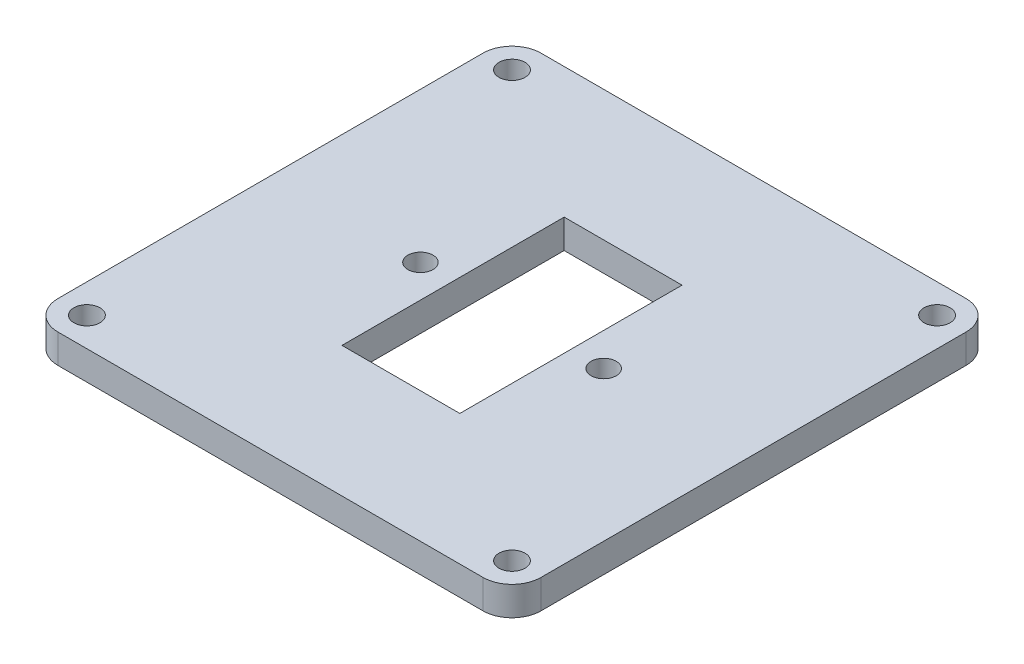
ISO-10303-21;
HEADER;
FILE_DESCRIPTION(('STEP AP214'),'2;1');
FILE_NAME('part.step','',(''),(''),'','','');
FILE_SCHEMA(('AUTOMOTIVE_DESIGN { 1 0 10303 214 1 1 1 1 }'));
ENDSEC;
DATA;
#1=APPLICATION_CONTEXT('core data for automotive mechanical design processes');
#2=APPLICATION_PROTOCOL_DEFINITION('international standard','automotive_design',2000,#1);
#3=PRODUCT_CONTEXT('',#1,'mechanical');
#4=PRODUCT('Part','Part','',(#3));
#5=PRODUCT_RELATED_PRODUCT_CATEGORY('part','',(#4));
#6=PRODUCT_DEFINITION_FORMATION('','',#4);
#7=PRODUCT_DEFINITION_CONTEXT('part definition',#1,'design');
#8=PRODUCT_DEFINITION('design','',#6,#7);
#9=PRODUCT_DEFINITION_SHAPE('','',#8);
#10=(LENGTH_UNIT() NAMED_UNIT(*) SI_UNIT(.MILLI.,.METRE.));
#11=(NAMED_UNIT(*) PLANE_ANGLE_UNIT() SI_UNIT($,.RADIAN.));
#12=(NAMED_UNIT(*) SI_UNIT($,.STERADIAN.) SOLID_ANGLE_UNIT());
#13=UNCERTAINTY_MEASURE_WITH_UNIT(LENGTH_MEASURE(1.E-05),#10,'distance_accuracy_value','');
#14=(GEOMETRIC_REPRESENTATION_CONTEXT(3) GLOBAL_UNCERTAINTY_ASSIGNED_CONTEXT((#13)) GLOBAL_UNIT_ASSIGNED_CONTEXT((#10,
#11,#12)) REPRESENTATION_CONTEXT('',''));
#15=CARTESIAN_POINT('',(0.,0.,0.));
#16=DIRECTION('',(0.,0.,1.));
#17=DIRECTION('',(1.,0.,0.));
#18=AXIS2_PLACEMENT_3D('',#15,#16,#17);
#19=CARTESIAN_POINT('',(-25.6485432343659,2.09377644502146,3.));
#20=DIRECTION('',(0.,-1.,0.));
#21=DIRECTION('',(0.,0.,-1.));
#22=AXIS2_PLACEMENT_3D('',#19,#20,#21);
#23=CYLINDRICAL_SURFACE('',#22,3.);
#24=CARTESIAN_POINT('',(-25.6485432343659,-0.90622355499125,3.));
#25=DIRECTION('',(0.,-1.,0.));
#26=DIRECTION('',(0.,0.,-1.));
#27=AXIS2_PLACEMENT_3D('',#24,#25,#26);
#28=CIRCLE('',#27,3.);
#29=CARTESIAN_POINT('',(-28.648543234366,-0.90622355499125,3.));
#30=VERTEX_POINT('',#29);
#31=CARTESIAN_POINT('',(-25.6485432343659,-0.90622355499125,0.));
#32=VERTEX_POINT('',#31);
#33=EDGE_CURVE('E196',#30,#32,#28,.T.);
#34=ORIENTED_EDGE('',*,*,#33,.F.);
#35=DIRECTION('',(0.,-1.,0.));
#36=VECTOR('',#35,1.);
#37=CARTESIAN_POINT('',(-28.648543234366,2.09377644502146,3.));
#38=LINE('',#37,#36);
#39=CARTESIAN_POINT('',(-28.648543234366,2.09377644502146,3.));
#40=VERTEX_POINT('',#39);
#41=EDGE_CURVE('E11',#40,#30,#38,.T.);
#42=ORIENTED_EDGE('',*,*,#41,.F.);
#43=CARTESIAN_POINT('',(-25.6485432343659,2.09377644502146,3.));
#44=DIRECTION('',(0.,-1.,0.));
#45=DIRECTION('',(0.,0.,-1.));
#46=AXIS2_PLACEMENT_3D('',#43,#44,#45);
#47=CIRCLE('',#46,3.);
#48=CARTESIAN_POINT('',(-25.6485432343659,2.09377644502146,0.));
#49=VERTEX_POINT('',#48);
#50=EDGE_CURVE('E199',#40,#49,#47,.T.);
#51=ORIENTED_EDGE('',*,*,#50,.T.);
#52=DIRECTION('',(0.,-1.,0.));
#53=VECTOR('',#52,1.);
#54=CARTESIAN_POINT('',(-25.6485432343659,2.09377644502146,0.));
#55=LINE('',#54,#53);
#56=EDGE_CURVE('E40',#49,#32,#55,.T.);
#57=ORIENTED_EDGE('',*,*,#56,.T.);
#58=EDGE_LOOP('',(#34,#42,#51,#57));
#59=FACE_BOUND('',#58,.T.);
#60=ADVANCED_FACE('F37',(#59),#23,.T.);
#61=CARTESIAN_POINT('',(-28.648543234366,2.09377644502146,46.9999489860236));
#62=DIRECTION('',(-1.,0.,0.));
#63=DIRECTION('',(0.,0.,1.));
#64=AXIS2_PLACEMENT_3D('',#61,#62,#63);
#65=PLANE('',#64);
#66=DIRECTION('',(0.,0.,-1.));
#67=VECTOR('',#66,1.);
#68=CARTESIAN_POINT('',(-28.648543234366,-0.90622355499125,46.9999489860236));
#69=LINE('',#68,#67);
#70=CARTESIAN_POINT('',(-28.648543234366,-0.90622355499125,46.9999489860236));
#71=VERTEX_POINT('',#70);
#72=EDGE_CURVE('E203',#71,#30,#69,.T.);
#73=ORIENTED_EDGE('',*,*,#72,.F.);
#74=DIRECTION('',(0.,-1.,0.));
#75=VECTOR('',#74,1.);
#76=CARTESIAN_POINT('',(-28.648543234366,2.09377644502146,46.9999489860236));
#77=LINE('',#76,#75);
#78=CARTESIAN_POINT('',(-28.648543234366,2.09377644502146,46.9999489860236));
#79=VERTEX_POINT('',#78);
#80=EDGE_CURVE('E45',#79,#71,#77,.T.);
#81=ORIENTED_EDGE('',*,*,#80,.F.);
#82=DIRECTION('',(0.,0.,-1.));
#83=VECTOR('',#82,1.);
#84=CARTESIAN_POINT('',(-28.648543234366,2.09377644502146,46.9999489860236));
#85=LINE('',#84,#83);
#86=EDGE_CURVE('E221',#79,#40,#85,.T.);
#87=ORIENTED_EDGE('',*,*,#86,.T.);
#88=ORIENTED_EDGE('',*,*,#41,.T.);
#89=EDGE_LOOP('',(#73,#81,#87,#88));
#90=FACE_BOUND('',#89,.T.);
#91=ADVANCED_FACE('F268',(#90),#65,.T.);
#92=CARTESIAN_POINT('',(-25.6485432343659,2.09377644502146,46.9999489860236));
#93=DIRECTION('',(0.,-1.,0.));
#94=DIRECTION('',(0.,0.,-1.));
#95=AXIS2_PLACEMENT_3D('',#92,#93,#94);
#96=CYLINDRICAL_SURFACE('',#95,3.);
#97=CARTESIAN_POINT('',(-25.6485432343659,-0.90622355499125,46.9999489860236));
#98=DIRECTION('',(0.,-1.,0.));
#99=DIRECTION('',(0.,0.,-1.));
#100=AXIS2_PLACEMENT_3D('',#97,#98,#99);
#101=CIRCLE('',#100,3.);
#102=CARTESIAN_POINT('',(-25.6485432343659,-0.90622355499125,49.9999489860236));
#103=VERTEX_POINT('',#102);
#104=EDGE_CURVE('E241',#103,#71,#101,.T.);
#105=ORIENTED_EDGE('',*,*,#104,.F.);
#106=DIRECTION('',(0.,-1.,0.));
#107=VECTOR('',#106,1.);
#108=CARTESIAN_POINT('',(-25.6485432343659,2.09377644502146,49.9999489860236));
#109=LINE('',#108,#107);
#110=CARTESIAN_POINT('',(-25.6485432343659,2.09377644502146,49.9999489860236));
#111=VERTEX_POINT('',#110);
#112=EDGE_CURVE('E247',#111,#103,#109,.T.);
#113=ORIENTED_EDGE('',*,*,#112,.F.);
#114=CARTESIAN_POINT('',(-25.6485432343659,2.09377644502146,46.9999489860236));
#115=DIRECTION('',(0.,-1.,0.));
#116=DIRECTION('',(0.,0.,-1.));
#117=AXIS2_PLACEMENT_3D('',#114,#115,#116);
#118=CIRCLE('',#117,3.);
#119=EDGE_CURVE('E218',#111,#79,#118,.T.);
#120=ORIENTED_EDGE('',*,*,#119,.T.);
#121=ORIENTED_EDGE('',*,*,#80,.T.);
#122=EDGE_LOOP('',(#105,#113,#120,#121));
#123=FACE_BOUND('',#122,.T.);
#124=ADVANCED_FACE('F288',(#123),#96,.T.);
#125=CARTESIAN_POINT('',(18.3511023050874,2.09377644502146,49.9999489860236));
#126=DIRECTION('',(0.,0.,1.));
#127=DIRECTION('',(1.,0.,0.));
#128=AXIS2_PLACEMENT_3D('',#125,#126,#127);
#129=PLANE('',#128);
#130=DIRECTION('',(-1.,0.,0.));
#131=VECTOR('',#130,1.);
#132=CARTESIAN_POINT('',(18.3511023050874,-0.90622355499125,49.9999489860236));
#133=LINE('',#132,#131);
#134=CARTESIAN_POINT('',(18.3511023050874,-0.90622355499125,49.9999489860236));
#135=VERTEX_POINT('',#134);
#136=EDGE_CURVE('E238',#135,#103,#133,.T.);
#137=ORIENTED_EDGE('',*,*,#136,.F.);
#138=DIRECTION('',(0.,-1.,0.));
#139=VECTOR('',#138,1.);
#140=CARTESIAN_POINT('',(18.3511023050874,2.09377644502146,49.9999489860236));
#141=LINE('',#140,#139);
#142=CARTESIAN_POINT('',(18.3511023050874,2.09377644502146,49.9999489860236));
#143=VERTEX_POINT('',#142);
#144=EDGE_CURVE('E249',#143,#135,#141,.T.);
#145=ORIENTED_EDGE('',*,*,#144,.F.);
#146=DIRECTION('',(-1.,0.,0.));
#147=VECTOR('',#146,1.);
#148=CARTESIAN_POINT('',(18.3511023050874,2.09377644502146,49.9999489860236));
#149=LINE('',#148,#147);
#150=EDGE_CURVE('E215',#143,#111,#149,.T.);
#151=ORIENTED_EDGE('',*,*,#150,.T.);
#152=ORIENTED_EDGE('',*,*,#112,.T.);
#153=EDGE_LOOP('',(#137,#145,#151,#152));
#154=FACE_BOUND('',#153,.T.);
#155=ADVANCED_FACE('F286',(#154),#129,.T.);
#156=CARTESIAN_POINT('',(18.3511023050874,2.09377644502146,46.9999489860236));
#157=DIRECTION('',(0.,-1.,0.));
#158=DIRECTION('',(0.,0.,-1.));
#159=AXIS2_PLACEMENT_3D('',#156,#157,#158);
#160=CYLINDRICAL_SURFACE('',#159,3.);
#161=CARTESIAN_POINT('',(18.3511023050874,-0.90622355499125,46.9999489860236));
#162=DIRECTION('',(0.,-1.,0.));
#163=DIRECTION('',(0.,0.,-1.));
#164=AXIS2_PLACEMENT_3D('',#161,#162,#163);
#165=CIRCLE('',#164,3.);
#166=CARTESIAN_POINT('',(21.3511023050874,-0.90622355499125,46.9999489860236));
#167=VERTEX_POINT('',#166);
#168=EDGE_CURVE('E235',#167,#135,#165,.T.);
#169=ORIENTED_EDGE('',*,*,#168,.F.);
#170=DIRECTION('',(0.,-1.,0.));
#171=VECTOR('',#170,1.);
#172=CARTESIAN_POINT('',(21.3511023050874,2.09377644502146,46.9999489860236));
#173=LINE('',#172,#171);
#174=CARTESIAN_POINT('',(21.3511023050874,2.09377644502146,46.9999489860236));
#175=VERTEX_POINT('',#174);
#176=EDGE_CURVE('E251',#175,#167,#173,.T.);
#177=ORIENTED_EDGE('',*,*,#176,.F.);
#178=CARTESIAN_POINT('',(18.3511023050874,2.09377644502146,46.9999489860236));
#179=DIRECTION('',(0.,-1.,0.));
#180=DIRECTION('',(0.,0.,-1.));
#181=AXIS2_PLACEMENT_3D('',#178,#179,#180);
#182=CIRCLE('',#181,3.);
#183=EDGE_CURVE('E212',#175,#143,#182,.T.);
#184=ORIENTED_EDGE('',*,*,#183,.T.);
#185=ORIENTED_EDGE('',*,*,#144,.T.);
#186=EDGE_LOOP('',(#169,#177,#184,#185));
#187=FACE_BOUND('',#186,.T.);
#188=ADVANCED_FACE('F282',(#187),#160,.T.);
#189=CARTESIAN_POINT('',(21.3511023050874,2.09377644502146,3.));
#190=DIRECTION('',(1.,0.,0.));
#191=DIRECTION('',(0.,0.,-1.));
#192=AXIS2_PLACEMENT_3D('',#189,#190,#191);
#193=PLANE('',#192);
#194=DIRECTION('',(0.,0.,1.));
#195=VECTOR('',#194,1.);
#196=CARTESIAN_POINT('',(21.3511023050874,-0.90622355499125,3.));
#197=LINE('',#196,#195);
#198=CARTESIAN_POINT('',(21.3511023050874,-0.90622355499125,3.));
#199=VERTEX_POINT('',#198);
#200=EDGE_CURVE('E232',#199,#167,#197,.T.);
#201=ORIENTED_EDGE('',*,*,#200,.F.);
#202=DIRECTION('',(0.,-1.,0.));
#203=VECTOR('',#202,1.);
#204=CARTESIAN_POINT('',(21.3511023050874,2.09377644502146,3.));
#205=LINE('',#204,#203);
#206=CARTESIAN_POINT('',(21.3511023050874,2.09377644502146,3.));
#207=VERTEX_POINT('',#206);
#208=EDGE_CURVE('E253',#207,#199,#205,.T.);
#209=ORIENTED_EDGE('',*,*,#208,.F.);
#210=DIRECTION('',(0.,0.,1.));
#211=VECTOR('',#210,1.);
#212=CARTESIAN_POINT('',(21.3511023050874,2.09377644502146,3.));
#213=LINE('',#212,#211);
#214=EDGE_CURVE('E209',#207,#175,#213,.T.);
#215=ORIENTED_EDGE('',*,*,#214,.T.);
#216=ORIENTED_EDGE('',*,*,#176,.T.);
#217=EDGE_LOOP('',(#201,#209,#215,#216));
#218=FACE_BOUND('',#217,.T.);
#219=ADVANCED_FACE('F280',(#218),#193,.T.);
#220=CARTESIAN_POINT('',(18.3511023050874,2.09377644502146,3.));
#221=DIRECTION('',(0.,-1.,0.));
#222=DIRECTION('',(0.,0.,-1.));
#223=AXIS2_PLACEMENT_3D('',#220,#221,#222);
#224=CYLINDRICAL_SURFACE('',#223,3.);
#225=CARTESIAN_POINT('',(18.3511023050874,-0.90622355499125,3.));
#226=DIRECTION('',(0.,-1.,0.));
#227=DIRECTION('',(0.,0.,-1.));
#228=AXIS2_PLACEMENT_3D('',#225,#226,#227);
#229=CIRCLE('',#228,3.);
#230=CARTESIAN_POINT('',(18.3511023050874,-0.90622355499125,0.));
#231=VERTEX_POINT('',#230);
#232=EDGE_CURVE('E229',#231,#199,#229,.T.);
#233=ORIENTED_EDGE('',*,*,#232,.F.);
#234=DIRECTION('',(0.,-1.,0.));
#235=VECTOR('',#234,1.);
#236=CARTESIAN_POINT('',(18.3511023050874,2.09377644502146,0.));
#237=LINE('',#236,#235);
#238=CARTESIAN_POINT('',(18.3511023050874,2.09377644502146,0.));
#239=VERTEX_POINT('',#238);
#240=EDGE_CURVE('E254',#239,#231,#237,.T.);
#241=ORIENTED_EDGE('',*,*,#240,.F.);
#242=CARTESIAN_POINT('',(18.3511023050874,2.09377644502146,3.));
#243=DIRECTION('',(0.,-1.,0.));
#244=DIRECTION('',(0.,0.,-1.));
#245=AXIS2_PLACEMENT_3D('',#242,#243,#244);
#246=CIRCLE('',#245,3.);
#247=EDGE_CURVE('E206',#239,#207,#246,.T.);
#248=ORIENTED_EDGE('',*,*,#247,.T.);
#249=ORIENTED_EDGE('',*,*,#208,.T.);
#250=EDGE_LOOP('',(#233,#241,#248,#249));
#251=FACE_BOUND('',#250,.T.);
#252=ADVANCED_FACE('F276',(#251),#224,.T.);
#253=CARTESIAN_POINT('',(-25.6485432343659,2.09377644502146,0.));
#254=DIRECTION('',(0.,0.,-1.));
#255=DIRECTION('',(-1.,0.,0.));
#256=AXIS2_PLACEMENT_3D('',#253,#254,#255);
#257=PLANE('',#256);
#258=DIRECTION('',(1.,0.,0.));
#259=VECTOR('',#258,1.);
#260=CARTESIAN_POINT('',(-25.6485432343659,-0.90622355499125,0.));
#261=LINE('',#260,#259);
#262=EDGE_CURVE('E226',#32,#231,#261,.T.);
#263=ORIENTED_EDGE('',*,*,#262,.F.);
#264=ORIENTED_EDGE('',*,*,#56,.F.);
#265=DIRECTION('',(1.,0.,0.));
#266=VECTOR('',#265,1.);
#267=CARTESIAN_POINT('',(-25.6485432343659,2.09377644502146,0.));
#268=LINE('',#267,#266);
#269=EDGE_CURVE('E202',#49,#239,#268,.T.);
#270=ORIENTED_EDGE('',*,*,#269,.T.);
#271=ORIENTED_EDGE('',*,*,#240,.T.);
#272=EDGE_LOOP('',(#263,#264,#270,#271));
#273=FACE_BOUND('',#272,.T.);
#274=ADVANCED_FACE('F262',(#273),#257,.T.);
#275=CARTESIAN_POINT('',(-25.6485432343659,2.09377644502146,3.));
#276=DIRECTION('',(0.,-1.,0.));
#277=DIRECTION('',(0.,0.,-1.));
#278=AXIS2_PLACEMENT_3D('',#275,#276,#277);
#279=PLANE('',#278);
#280=DIRECTION('',(0.,0.,-1.));
#281=VECTOR('',#280,1.);
#282=CARTESIAN_POINT('',(-9.74872103199559,2.09377644502146,13.5001564161645));
#283=LINE('',#282,#281);
#284=CARTESIAN_POINT('',(-9.74872103199559,2.09377644502146,36.5008594697819));
#285=VERTEX_POINT('',#284);
#286=CARTESIAN_POINT('',(-9.74872103199559,2.09377644502146,13.5001564161645));
#287=VERTEX_POINT('',#286);
#288=EDGE_CURVE('E134',#285,#287,#283,.T.);
#289=ORIENTED_EDGE('',*,*,#288,.T.);
#290=DIRECTION('',(1.,0.,0.));
#291=VECTOR('',#290,1.);
#292=CARTESIAN_POINT('',(2.45169906501979,2.09377644502146,13.5001564161645));
#293=LINE('',#292,#291);
#294=CARTESIAN_POINT('',(2.45169906501979,2.09377644502146,13.5001564161645));
#295=VERTEX_POINT('',#294);
#296=EDGE_CURVE('E128',#287,#295,#293,.T.);
#297=ORIENTED_EDGE('',*,*,#296,.T.);
#298=DIRECTION('',(0.,0.,1.));
#299=VECTOR('',#298,1.);
#300=CARTESIAN_POINT('',(2.45169906501979,2.09377644502146,36.5008594697819));
#301=LINE('',#300,#299);
#302=CARTESIAN_POINT('',(2.45169906501979,2.09377644502146,36.5008594697819));
#303=VERTEX_POINT('',#302);
#304=EDGE_CURVE('E137',#295,#303,#301,.T.);
#305=ORIENTED_EDGE('',*,*,#304,.T.);
#306=DIRECTION('',(-1.,0.,0.));
#307=VECTOR('',#306,1.);
#308=CARTESIAN_POINT('',(-9.74872103199559,2.09377644502146,36.5008594697819));
#309=LINE('',#308,#307);
#310=EDGE_CURVE('E53',#303,#285,#309,.T.);
#311=ORIENTED_EDGE('',*,*,#310,.T.);
#312=EDGE_LOOP('',(#289,#297,#305,#311));
#313=FACE_BOUND('',#312,.T.);
#314=CARTESIAN_POINT('',(-13.1299046165957,2.09377644502146,24.9945014619877));
#315=DIRECTION('',(0.,-1.,0.));
#316=DIRECTION('',(0.,0.,1.));
#317=AXIS2_PLACEMENT_3D('',#314,#315,#316);
#318=CIRCLE('',#317,1.3);
#319=CARTESIAN_POINT('',(-13.1299046165957,2.09377644502146,26.2945014619877));
#320=VERTEX_POINT('',#319);
#321=EDGE_CURVE('E163',#320,#320,#318,.T.);
#322=ORIENTED_EDGE('',*,*,#321,.T.);
#323=EDGE_LOOP('',(#322));
#324=FACE_BOUND('',#323,.T.);
#325=CARTESIAN_POINT('',(5.87053383881225,2.09377644502146,25.0265481818453));
#326=DIRECTION('',(0.,-1.,0.));
#327=DIRECTION('',(0.,0.,1.));
#328=AXIS2_PLACEMENT_3D('',#325,#326,#327);
#329=CIRCLE('',#328,1.3);
#330=CARTESIAN_POINT('',(5.87053383881225,2.09377644502146,26.3265481818454));
#331=VERTEX_POINT('',#330);
#332=EDGE_CURVE('E169',#331,#331,#329,.T.);
#333=ORIENTED_EDGE('',*,*,#332,.T.);
#334=EDGE_LOOP('',(#333));
#335=FACE_BOUND('',#334,.T.);
#336=CARTESIAN_POINT('',(18.3511023050874,2.09377644502146,3.));
#337=DIRECTION('',(0.,-1.,0.));
#338=DIRECTION('',(0.,0.,1.));
#339=AXIS2_PLACEMENT_3D('',#336,#337,#338);
#340=CIRCLE('',#339,1.35);
#341=CARTESIAN_POINT('',(18.3511023050874,2.09377644502146,4.35));
#342=VERTEX_POINT('',#341);
#343=EDGE_CURVE('E175',#342,#342,#340,.T.);
#344=ORIENTED_EDGE('',*,*,#343,.T.);
#345=EDGE_LOOP('',(#344));
#346=FACE_BOUND('',#345,.T.);
#347=CARTESIAN_POINT('',(-25.6485432343659,2.09377644502146,46.9999489860236));
#348=DIRECTION('',(0.,-1.,0.));
#349=DIRECTION('',(0.,0.,1.));
#350=AXIS2_PLACEMENT_3D('',#347,#348,#349);
#351=CIRCLE('',#350,1.35);
#352=CARTESIAN_POINT('',(-25.6485432343659,2.09377644502146,48.3499489860236));
#353=VERTEX_POINT('',#352);
#354=EDGE_CURVE('E181',#353,#353,#351,.T.);
#355=ORIENTED_EDGE('',*,*,#354,.T.);
#356=EDGE_LOOP('',(#355));
#357=FACE_BOUND('',#356,.T.);
#358=CARTESIAN_POINT('',(-25.6485432343659,2.09377644502146,3.));
#359=DIRECTION('',(0.,-1.,0.));
#360=DIRECTION('',(0.,0.,1.));
#361=AXIS2_PLACEMENT_3D('',#358,#359,#360);
#362=CIRCLE('',#361,1.35);
#363=CARTESIAN_POINT('',(-25.6485432343659,2.09377644502146,4.35));
#364=VERTEX_POINT('',#363);
#365=EDGE_CURVE('E187',#364,#364,#362,.T.);
#366=ORIENTED_EDGE('',*,*,#365,.T.);
#367=EDGE_LOOP('',(#366));
#368=FACE_BOUND('',#367,.T.);
#369=CARTESIAN_POINT('',(18.3511023050874,2.09377644502146,46.9999489860236));
#370=DIRECTION('',(0.,-1.,0.));
#371=DIRECTION('',(0.,0.,1.));
#372=AXIS2_PLACEMENT_3D('',#369,#370,#371);
#373=CIRCLE('',#372,1.35);
#374=CARTESIAN_POINT('',(18.3511023050874,2.09377644502146,48.3499489860236));
#375=VERTEX_POINT('',#374);
#376=EDGE_CURVE('E193',#375,#375,#373,.T.);
#377=ORIENTED_EDGE('',*,*,#376,.T.);
#378=EDGE_LOOP('',(#377));
#379=FACE_BOUND('',#378,.T.);
#380=ORIENTED_EDGE('',*,*,#50,.F.);
#381=ORIENTED_EDGE('',*,*,#86,.F.);
#382=ORIENTED_EDGE('',*,*,#119,.F.);
#383=ORIENTED_EDGE('',*,*,#150,.F.);
#384=ORIENTED_EDGE('',*,*,#183,.F.);
#385=ORIENTED_EDGE('',*,*,#214,.F.);
#386=ORIENTED_EDGE('',*,*,#247,.F.);
#387=ORIENTED_EDGE('',*,*,#269,.F.);
#388=EDGE_LOOP('',(#380,#381,#382,#383,#384,#385,#386,#387));
#389=FACE_BOUND('',#388,.T.);
#390=ADVANCED_FACE('F141',(#313,#324,#335,#346,#357,#368,#379,#389),#279,.F.);
#391=CARTESIAN_POINT('',(-25.6485432343659,-0.90622355499125,3.));
#392=DIRECTION('',(0.,-1.,0.));
#393=DIRECTION('',(0.,0.,-1.));
#394=AXIS2_PLACEMENT_3D('',#391,#392,#393);
#395=PLANE('',#394);
#396=DIRECTION('',(1.,0.,0.));
#397=VECTOR('',#396,1.);
#398=CARTESIAN_POINT('',(2.45169906501979,-0.90622355499125,13.5001564161645));
#399=LINE('',#398,#397);
#400=CARTESIAN_POINT('',(-9.74872103199559,-0.90622355499125,13.5001564161645));
#401=VERTEX_POINT('',#400);
#402=CARTESIAN_POINT('',(2.45169906501979,-0.90622355499125,13.5001564161645));
#403=VERTEX_POINT('',#402);
#404=EDGE_CURVE('E61',#401,#403,#399,.T.);
#405=ORIENTED_EDGE('',*,*,#404,.F.);
#406=DIRECTION('',(0.,0.,-1.));
#407=VECTOR('',#406,1.);
#408=CARTESIAN_POINT('',(-9.74872103199559,-0.90622355499125,13.5001564161645));
#409=LINE('',#408,#407);
#410=CARTESIAN_POINT('',(-9.74872103199559,-0.90622355499125,36.5008594697819));
#411=VERTEX_POINT('',#410);
#412=EDGE_CURVE('E144',#411,#401,#409,.T.);
#413=ORIENTED_EDGE('',*,*,#412,.F.);
#414=DIRECTION('',(-1.,0.,0.));
#415=VECTOR('',#414,1.);
#416=CARTESIAN_POINT('',(-9.74872103199559,-0.90622355499125,36.5008594697819));
#417=LINE('',#416,#415);
#418=CARTESIAN_POINT('',(2.45169906501979,-0.90622355499125,36.5008594697819));
#419=VERTEX_POINT('',#418);
#420=EDGE_CURVE('E147',#419,#411,#417,.T.);
#421=ORIENTED_EDGE('',*,*,#420,.F.);
#422=DIRECTION('',(0.,0.,1.));
#423=VECTOR('',#422,1.);
#424=CARTESIAN_POINT('',(2.45169906501979,-0.90622355499125,36.5008594697819));
#425=LINE('',#424,#423);
#426=EDGE_CURVE('E153',#403,#419,#425,.T.);
#427=ORIENTED_EDGE('',*,*,#426,.F.);
#428=EDGE_LOOP('',(#405,#413,#421,#427));
#429=FACE_BOUND('',#428,.T.);
#430=CARTESIAN_POINT('',(-13.1299046165957,-0.90622355499125,24.9945014619877));
#431=DIRECTION('',(0.,-1.,0.));
#432=DIRECTION('',(0.,0.,1.));
#433=AXIS2_PLACEMENT_3D('',#430,#431,#432);
#434=CIRCLE('',#433,1.3);
#435=CARTESIAN_POINT('',(-13.1299046165957,-0.90622355499125,26.2945014619877));
#436=VERTEX_POINT('',#435);
#437=EDGE_CURVE('E159',#436,#436,#434,.T.);
#438=ORIENTED_EDGE('',*,*,#437,.F.);
#439=EDGE_LOOP('',(#438));
#440=FACE_BOUND('',#439,.T.);
#441=CARTESIAN_POINT('',(5.87053383881225,-0.90622355499125,25.0265481818453));
#442=DIRECTION('',(0.,-1.,0.));
#443=DIRECTION('',(0.,0.,1.));
#444=AXIS2_PLACEMENT_3D('',#441,#442,#443);
#445=CIRCLE('',#444,1.3);
#446=CARTESIAN_POINT('',(5.87053383881225,-0.90622355499125,26.3265481818454));
#447=VERTEX_POINT('',#446);
#448=EDGE_CURVE('E166',#447,#447,#445,.T.);
#449=ORIENTED_EDGE('',*,*,#448,.F.);
#450=EDGE_LOOP('',(#449));
#451=FACE_BOUND('',#450,.T.);
#452=CARTESIAN_POINT('',(18.3511023050874,-0.90622355499125,3.));
#453=DIRECTION('',(0.,-1.,0.));
#454=DIRECTION('',(0.,0.,1.));
#455=AXIS2_PLACEMENT_3D('',#452,#453,#454);
#456=CIRCLE('',#455,1.35);
#457=CARTESIAN_POINT('',(18.3511023050874,-0.90622355499125,4.35));
#458=VERTEX_POINT('',#457);
#459=EDGE_CURVE('E172',#458,#458,#456,.T.);
#460=ORIENTED_EDGE('',*,*,#459,.F.);
#461=EDGE_LOOP('',(#460));
#462=FACE_BOUND('',#461,.T.);
#463=CARTESIAN_POINT('',(-25.6485432343659,-0.90622355499125,46.9999489860236));
#464=DIRECTION('',(0.,-1.,0.));
#465=DIRECTION('',(0.,0.,1.));
#466=AXIS2_PLACEMENT_3D('',#463,#464,#465);
#467=CIRCLE('',#466,1.35);
#468=CARTESIAN_POINT('',(-25.6485432343659,-0.90622355499125,48.3499489860236));
#469=VERTEX_POINT('',#468);
#470=EDGE_CURVE('E178',#469,#469,#467,.T.);
#471=ORIENTED_EDGE('',*,*,#470,.F.);
#472=EDGE_LOOP('',(#471));
#473=FACE_BOUND('',#472,.T.);
#474=CARTESIAN_POINT('',(-25.6485432343659,-0.90622355499125,3.));
#475=DIRECTION('',(0.,-1.,0.));
#476=DIRECTION('',(0.,0.,1.));
#477=AXIS2_PLACEMENT_3D('',#474,#475,#476);
#478=CIRCLE('',#477,1.35);
#479=CARTESIAN_POINT('',(-25.6485432343659,-0.90622355499125,4.35));
#480=VERTEX_POINT('',#479);
#481=EDGE_CURVE('E184',#480,#480,#478,.T.);
#482=ORIENTED_EDGE('',*,*,#481,.F.);
#483=EDGE_LOOP('',(#482));
#484=FACE_BOUND('',#483,.T.);
#485=CARTESIAN_POINT('',(18.3511023050874,-0.90622355499125,46.9999489860236));
#486=DIRECTION('',(0.,-1.,0.));
#487=DIRECTION('',(0.,0.,1.));
#488=AXIS2_PLACEMENT_3D('',#485,#486,#487);
#489=CIRCLE('',#488,1.35);
#490=CARTESIAN_POINT('',(18.3511023050874,-0.90622355499125,48.3499489860236));
#491=VERTEX_POINT('',#490);
#492=EDGE_CURVE('E190',#491,#491,#489,.T.);
#493=ORIENTED_EDGE('',*,*,#492,.F.);
#494=EDGE_LOOP('',(#493));
#495=FACE_BOUND('',#494,.T.);
#496=ORIENTED_EDGE('',*,*,#33,.T.);
#497=ORIENTED_EDGE('',*,*,#262,.T.);
#498=ORIENTED_EDGE('',*,*,#232,.T.);
#499=ORIENTED_EDGE('',*,*,#200,.T.);
#500=ORIENTED_EDGE('',*,*,#168,.T.);
#501=ORIENTED_EDGE('',*,*,#136,.T.);
#502=ORIENTED_EDGE('',*,*,#104,.T.);
#503=ORIENTED_EDGE('',*,*,#72,.T.);
#504=EDGE_LOOP('',(#496,#497,#498,#499,#500,#501,#502,#503));
#505=FACE_BOUND('',#504,.T.);
#506=ADVANCED_FACE('F264',(#429,#440,#451,#462,#473,#484,#495,#505),#395,.T.);
#507=CARTESIAN_POINT('',(18.3511023050874,2.09377644502146,46.9999489860236));
#508=DIRECTION('',(0.,-1.,0.));
#509=DIRECTION('',(0.,0.,-1.));
#510=AXIS2_PLACEMENT_3D('',#507,#508,#509);
#511=CYLINDRICAL_SURFACE('',#510,1.35);
#512=ORIENTED_EDGE('',*,*,#376,.F.);
#513=EDGE_LOOP('',(#512));
#514=FACE_BOUND('',#513,.T.);
#515=ORIENTED_EDGE('',*,*,#492,.T.);
#516=EDGE_LOOP('',(#515));
#517=FACE_BOUND('',#516,.T.);
#518=ADVANCED_FACE('F362',(#514,#517),#511,.F.);
#519=CARTESIAN_POINT('',(-25.6485432343659,2.09377644502146,3.));
#520=DIRECTION('',(0.,-1.,0.));
#521=DIRECTION('',(0.,0.,-1.));
#522=AXIS2_PLACEMENT_3D('',#519,#520,#521);
#523=CYLINDRICAL_SURFACE('',#522,1.35);
#524=ORIENTED_EDGE('',*,*,#365,.F.);
#525=EDGE_LOOP('',(#524));
#526=FACE_BOUND('',#525,.T.);
#527=ORIENTED_EDGE('',*,*,#481,.T.);
#528=EDGE_LOOP('',(#527));
#529=FACE_BOUND('',#528,.T.);
#530=ADVANCED_FACE('F372',(#526,#529),#523,.F.);
#531=CARTESIAN_POINT('',(-25.6485432343659,2.09377644502146,46.9999489860236));
#532=DIRECTION('',(0.,-1.,0.));
#533=DIRECTION('',(0.,0.,-1.));
#534=AXIS2_PLACEMENT_3D('',#531,#532,#533);
#535=CYLINDRICAL_SURFACE('',#534,1.35);
#536=ORIENTED_EDGE('',*,*,#354,.F.);
#537=EDGE_LOOP('',(#536));
#538=FACE_BOUND('',#537,.T.);
#539=ORIENTED_EDGE('',*,*,#470,.T.);
#540=EDGE_LOOP('',(#539));
#541=FACE_BOUND('',#540,.T.);
#542=ADVANCED_FACE('F382',(#538,#541),#535,.F.);
#543=CARTESIAN_POINT('',(18.3511023050874,2.09377644502146,3.));
#544=DIRECTION('',(0.,-1.,0.));
#545=DIRECTION('',(0.,0.,-1.));
#546=AXIS2_PLACEMENT_3D('',#543,#544,#545);
#547=CYLINDRICAL_SURFACE('',#546,1.35);
#548=ORIENTED_EDGE('',*,*,#343,.F.);
#549=EDGE_LOOP('',(#548));
#550=FACE_BOUND('',#549,.T.);
#551=ORIENTED_EDGE('',*,*,#459,.T.);
#552=EDGE_LOOP('',(#551));
#553=FACE_BOUND('',#552,.T.);
#554=ADVANCED_FACE('F392',(#550,#553),#547,.F.);
#555=CARTESIAN_POINT('',(5.87053383881225,2.09377644502146,25.0265481818453));
#556=DIRECTION('',(0.,-1.,0.));
#557=DIRECTION('',(0.,0.,-1.));
#558=AXIS2_PLACEMENT_3D('',#555,#556,#557);
#559=CYLINDRICAL_SURFACE('',#558,1.3);
#560=ORIENTED_EDGE('',*,*,#332,.F.);
#561=EDGE_LOOP('',(#560));
#562=FACE_BOUND('',#561,.T.);
#563=ORIENTED_EDGE('',*,*,#448,.T.);
#564=EDGE_LOOP('',(#563));
#565=FACE_BOUND('',#564,.T.);
#566=ADVANCED_FACE('F402',(#562,#565),#559,.F.);
#567=CARTESIAN_POINT('',(-13.1299046165957,2.09377644502146,24.9945014619877));
#568=DIRECTION('',(0.,-1.,0.));
#569=DIRECTION('',(0.,0.,-1.));
#570=AXIS2_PLACEMENT_3D('',#567,#568,#569);
#571=CYLINDRICAL_SURFACE('',#570,1.3);
#572=ORIENTED_EDGE('',*,*,#321,.F.);
#573=EDGE_LOOP('',(#572));
#574=FACE_BOUND('',#573,.T.);
#575=ORIENTED_EDGE('',*,*,#437,.T.);
#576=EDGE_LOOP('',(#575));
#577=FACE_BOUND('',#576,.T.);
#578=ADVANCED_FACE('F412',(#574,#577),#571,.F.);
#579=CARTESIAN_POINT('',(2.45169906501979,2.09377644502146,13.5001564161645));
#580=DIRECTION('',(0.,0.,-1.));
#581=DIRECTION('',(-1.,0.,0.));
#582=AXIS2_PLACEMENT_3D('',#579,#580,#581);
#583=PLANE('',#582);
#584=ORIENTED_EDGE('',*,*,#404,.T.);
#585=DIRECTION('',(0.,-1.,0.));
#586=VECTOR('',#585,1.);
#587=CARTESIAN_POINT('',(2.45169906501979,2.09377644502146,13.5001564161645));
#588=LINE('',#587,#586);
#589=EDGE_CURVE('E124',#295,#403,#588,.T.);
#590=ORIENTED_EDGE('',*,*,#589,.F.);
#591=ORIENTED_EDGE('',*,*,#296,.F.);
#592=DIRECTION('',(0.,-1.,0.));
#593=VECTOR('',#592,1.);
#594=CARTESIAN_POINT('',(-9.74872103199559,2.09377644502146,13.5001564161645));
#595=LINE('',#594,#593);
#596=EDGE_CURVE('E157',#287,#401,#595,.T.);
#597=ORIENTED_EDGE('',*,*,#596,.T.);
#598=EDGE_LOOP('',(#584,#590,#591,#597));
#599=FACE_BOUND('',#598,.T.);
#600=ADVANCED_FACE('F126',(#599),#583,.F.);
#601=CARTESIAN_POINT('',(-9.74872103199559,2.09377644502146,13.5001564161645));
#602=DIRECTION('',(-1.,0.,0.));
#603=DIRECTION('',(0.,0.,1.));
#604=AXIS2_PLACEMENT_3D('',#601,#602,#603);
#605=PLANE('',#604);
#606=ORIENTED_EDGE('',*,*,#412,.T.);
#607=ORIENTED_EDGE('',*,*,#596,.F.);
#608=ORIENTED_EDGE('',*,*,#288,.F.);
#609=DIRECTION('',(0.,-1.,0.));
#610=VECTOR('',#609,1.);
#611=CARTESIAN_POINT('',(-9.74872103199559,2.09377644502146,36.5008594697819));
#612=LINE('',#611,#610);
#613=EDGE_CURVE('E160',#285,#411,#612,.T.);
#614=ORIENTED_EDGE('',*,*,#613,.T.);
#615=EDGE_LOOP('',(#606,#607,#608,#614));
#616=FACE_BOUND('',#615,.T.);
#617=ADVANCED_FACE('F431',(#616),#605,.F.);
#618=CARTESIAN_POINT('',(-9.74872103199559,2.09377644502146,36.5008594697819));
#619=DIRECTION('',(0.,0.,1.));
#620=DIRECTION('',(1.,0.,0.));
#621=AXIS2_PLACEMENT_3D('',#618,#619,#620);
#622=PLANE('',#621);
#623=ORIENTED_EDGE('',*,*,#420,.T.);
#624=ORIENTED_EDGE('',*,*,#613,.F.);
#625=ORIENTED_EDGE('',*,*,#310,.F.);
#626=DIRECTION('',(0.,-1.,0.));
#627=VECTOR('',#626,1.);
#628=CARTESIAN_POINT('',(2.45169906501979,2.09377644502146,36.5008594697819));
#629=LINE('',#628,#627);
#630=EDGE_CURVE('E133',#303,#419,#629,.T.);
#631=ORIENTED_EDGE('',*,*,#630,.T.);
#632=EDGE_LOOP('',(#623,#624,#625,#631));
#633=FACE_BOUND('',#632,.T.);
#634=ADVANCED_FACE('F440',(#633),#622,.F.);
#635=CARTESIAN_POINT('',(2.45169906501979,2.09377644502146,36.5008594697819));
#636=DIRECTION('',(1.,0.,0.));
#637=DIRECTION('',(0.,0.,-1.));
#638=AXIS2_PLACEMENT_3D('',#635,#636,#637);
#639=PLANE('',#638);
#640=ORIENTED_EDGE('',*,*,#426,.T.);
#641=ORIENTED_EDGE('',*,*,#630,.F.);
#642=ORIENTED_EDGE('',*,*,#304,.F.);
#643=ORIENTED_EDGE('',*,*,#589,.T.);
#644=EDGE_LOOP('',(#640,#641,#642,#643));
#645=FACE_BOUND('',#644,.T.);
#646=ADVANCED_FACE('F138',(#645),#639,.F.);
#647=CLOSED_SHELL('',(#60,#91,#124,#155,#188,#219,#252,#274,#390,#506,#518,#530,#542,#554,#566,
#578,#600,#617,#634,#646));
#648=MANIFOLD_SOLID_BREP('B2',#647);
#649=ADVANCED_BREP_SHAPE_REPRESENTATION('',(#18,#648),#14);
#650=SHAPE_DEFINITION_REPRESENTATION(#9,#649);
ENDSEC;
END-ISO-10303-21;
